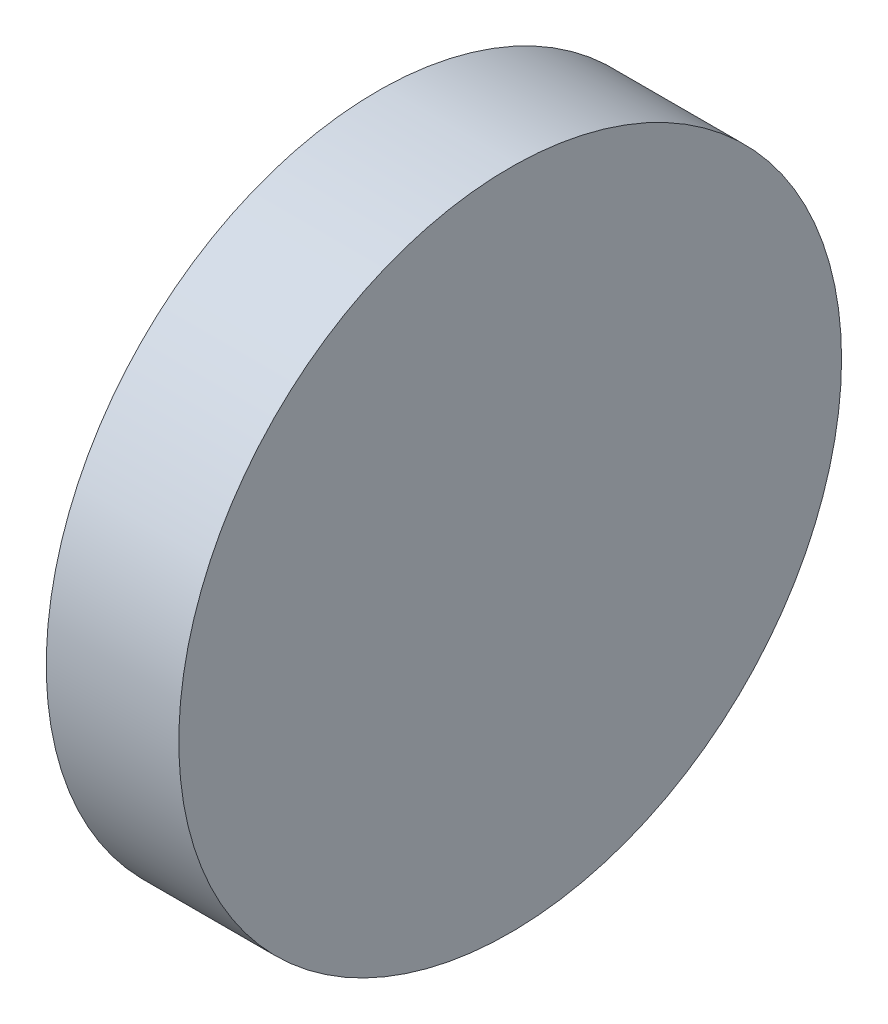
ISO-10303-21;
HEADER;
FILE_DESCRIPTION(('STEP AP214'),'2;1');
FILE_NAME('part.step','',(''),(''),'','','');
FILE_SCHEMA(('AUTOMOTIVE_DESIGN { 1 0 10303 214 1 1 1 1 }'));
ENDSEC;
DATA;
#1=APPLICATION_CONTEXT('core data for automotive mechanical design processes');
#2=APPLICATION_PROTOCOL_DEFINITION('international standard','automotive_design',2000,#1);
#3=PRODUCT_CONTEXT('',#1,'mechanical');
#4=PRODUCT('Part','Part','',(#3));
#5=PRODUCT_RELATED_PRODUCT_CATEGORY('part','',(#4));
#6=PRODUCT_DEFINITION_FORMATION('','',#4);
#7=PRODUCT_DEFINITION_CONTEXT('part definition',#1,'design');
#8=PRODUCT_DEFINITION('design','',#6,#7);
#9=PRODUCT_DEFINITION_SHAPE('','',#8);
#10=(LENGTH_UNIT() NAMED_UNIT(*) SI_UNIT(.MILLI.,.METRE.));
#11=(NAMED_UNIT(*) PLANE_ANGLE_UNIT() SI_UNIT($,.RADIAN.));
#12=(NAMED_UNIT(*) SI_UNIT($,.STERADIAN.) SOLID_ANGLE_UNIT());
#13=UNCERTAINTY_MEASURE_WITH_UNIT(LENGTH_MEASURE(1.E-05),#10,'distance_accuracy_value','');
#14=(GEOMETRIC_REPRESENTATION_CONTEXT(3) GLOBAL_UNCERTAINTY_ASSIGNED_CONTEXT((#13)) GLOBAL_UNIT_ASSIGNED_CONTEXT((#10,
#11,#12)) REPRESENTATION_CONTEXT('',''));
#15=CARTESIAN_POINT('',(0.,0.,0.));
#16=DIRECTION('',(0.,0.,1.));
#17=DIRECTION('',(1.,0.,0.));
#18=AXIS2_PLACEMENT_3D('',#15,#16,#17);
#19=CARTESIAN_POINT('',(0.5,0.,0.));
#20=DIRECTION('',(-1.,0.,0.));
#21=DIRECTION('',(0.,0.,1.));
#22=AXIS2_PLACEMENT_3D('',#19,#20,#21);
#23=CYLINDRICAL_SURFACE('',#22,2.5);
#24=CARTESIAN_POINT('',(0.5,0.,0.));
#25=DIRECTION('',(1.,0.,0.));
#26=DIRECTION('',(0.,0.,-1.));
#27=AXIS2_PLACEMENT_3D('',#24,#25,#26);
#28=CIRCLE('',#27,2.5);
#29=CARTESIAN_POINT('',(0.5,0.,-2.5));
#30=VERTEX_POINT('',#29);
#31=EDGE_CURVE('E10',#30,#30,#28,.T.);
#32=ORIENTED_EDGE('',*,*,#31,.F.);
#33=EDGE_LOOP('',(#32));
#34=FACE_BOUND('',#33,.T.);
#35=CARTESIAN_POINT('',(-0.5,0.,0.));
#36=DIRECTION('',(1.,0.,0.));
#37=DIRECTION('',(0.,0.,-1.));
#38=AXIS2_PLACEMENT_3D('',#35,#36,#37);
#39=CIRCLE('',#38,2.5);
#40=CARTESIAN_POINT('',(-0.5,0.,-2.5));
#41=VERTEX_POINT('',#40);
#42=EDGE_CURVE('E45',#41,#41,#39,.T.);
#43=ORIENTED_EDGE('',*,*,#42,.T.);
#44=EDGE_LOOP('',(#43));
#45=FACE_BOUND('',#44,.T.);
#46=ADVANCED_FACE('F39',(#34,#45),#23,.T.);
#47=CARTESIAN_POINT('',(0.5,0.,0.));
#48=DIRECTION('',(1.,0.,0.));
#49=DIRECTION('',(0.,0.,-1.));
#50=AXIS2_PLACEMENT_3D('',#47,#48,#49);
#51=PLANE('',#50);
#52=ORIENTED_EDGE('',*,*,#31,.T.);
#53=EDGE_LOOP('',(#52));
#54=FACE_BOUND('',#53,.T.);
#55=ADVANCED_FACE('F53',(#54),#51,.T.);
#56=CARTESIAN_POINT('',(-0.5,0.,0.));
#57=DIRECTION('',(1.,0.,0.));
#58=DIRECTION('',(0.,0.,-1.));
#59=AXIS2_PLACEMENT_3D('',#56,#57,#58);
#60=PLANE('',#59);
#61=ORIENTED_EDGE('',*,*,#42,.F.);
#62=EDGE_LOOP('',(#61));
#63=FACE_BOUND('',#62,.T.);
#64=ADVANCED_FACE('F55',(#63),#60,.F.);
#65=CLOSED_SHELL('',(#46,#55,#64));
#66=MANIFOLD_SOLID_BREP('B2',#65);
#67=ADVANCED_BREP_SHAPE_REPRESENTATION('',(#18,#66),#14);
#68=SHAPE_DEFINITION_REPRESENTATION(#9,#67);
ENDSEC;
END-ISO-10303-21;
